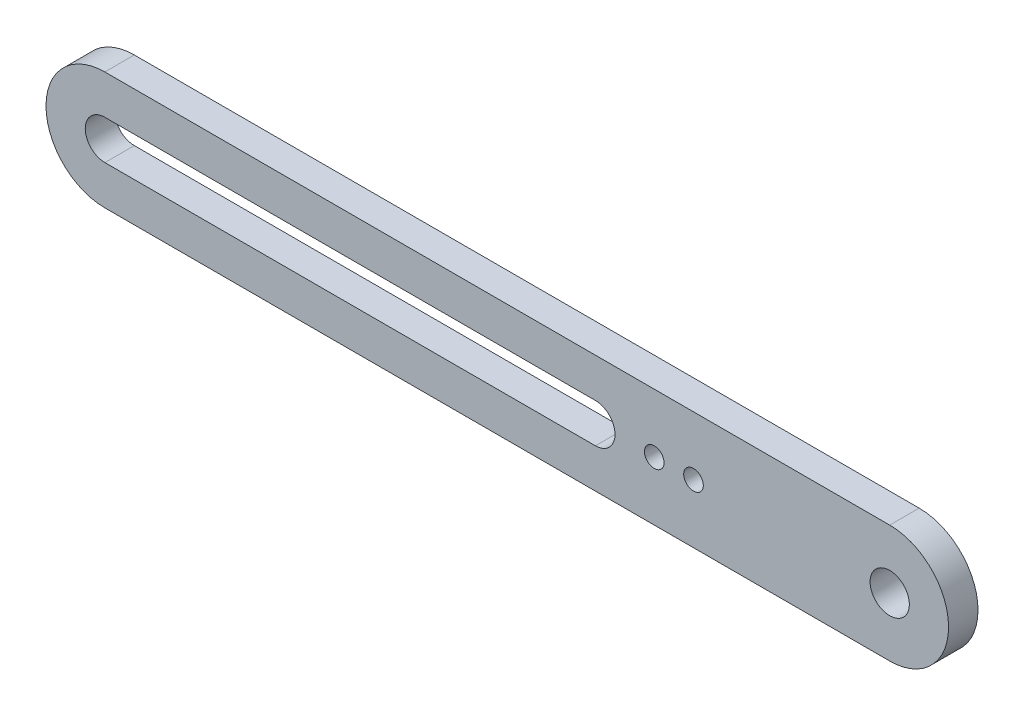
ISO-10303-21;
HEADER;
FILE_DESCRIPTION(('STEP AP214'),'2;1');
FILE_NAME('part.step','',(''),(''),'','','');
FILE_SCHEMA(('AUTOMOTIVE_DESIGN { 1 0 10303 214 1 1 1 1 }'));
ENDSEC;
DATA;
#1=APPLICATION_CONTEXT('core data for automotive mechanical design processes');
#2=APPLICATION_PROTOCOL_DEFINITION('international standard','automotive_design',2000,#1);
#3=PRODUCT_CONTEXT('',#1,'mechanical');
#4=PRODUCT('Part','Part','',(#3));
#5=PRODUCT_RELATED_PRODUCT_CATEGORY('part','',(#4));
#6=PRODUCT_DEFINITION_FORMATION('','',#4);
#7=PRODUCT_DEFINITION_CONTEXT('part definition',#1,'design');
#8=PRODUCT_DEFINITION('design','',#6,#7);
#9=PRODUCT_DEFINITION_SHAPE('','',#8);
#10=(LENGTH_UNIT() NAMED_UNIT(*) SI_UNIT(.MILLI.,.METRE.));
#11=(NAMED_UNIT(*) PLANE_ANGLE_UNIT() SI_UNIT($,.RADIAN.));
#12=(NAMED_UNIT(*) SI_UNIT($,.STERADIAN.) SOLID_ANGLE_UNIT());
#13=UNCERTAINTY_MEASURE_WITH_UNIT(LENGTH_MEASURE(1.E-05),#10,'distance_accuracy_value','');
#14=(GEOMETRIC_REPRESENTATION_CONTEXT(3) GLOBAL_UNCERTAINTY_ASSIGNED_CONTEXT((#13)) GLOBAL_UNIT_ASSIGNED_CONTEXT((#10,
#11,#12)) REPRESENTATION_CONTEXT('',''));
#15=CARTESIAN_POINT('',(0.,0.,0.));
#16=DIRECTION('',(0.,0.,1.));
#17=DIRECTION('',(1.,0.,0.));
#18=AXIS2_PLACEMENT_3D('',#15,#16,#17);
#19=CARTESIAN_POINT('',(0.,0.,0.));
#20=DIRECTION('',(0.,0.,1.));
#21=DIRECTION('',(1.,0.,0.));
#22=AXIS2_PLACEMENT_3D('',#19,#20,#21);
#23=PLANE('',#22);
#24=CARTESIAN_POINT('',(56.0000000000001,0.,0.));
#25=DIRECTION('',(0.,0.,-1.));
#26=DIRECTION('',(-1.,0.,0.));
#27=AXIS2_PLACEMENT_3D('',#24,#25,#26);
#28=CIRCLE('',#27,1.);
#29=CARTESIAN_POINT('',(55.0000000000001,0.,0.));
#30=VERTEX_POINT('',#29);
#31=EDGE_CURVE('E135',#30,#30,#28,.F.);
#32=ORIENTED_EDGE('',*,*,#31,.T.);
#33=EDGE_LOOP('',(#32));
#34=FACE_BOUND('',#33,.T.);
#35=CARTESIAN_POINT('',(60.0000000000001,0.,0.));
#36=DIRECTION('',(0.,0.,-1.));
#37=DIRECTION('',(-1.,0.,0.));
#38=AXIS2_PLACEMENT_3D('',#35,#36,#37);
#39=CIRCLE('',#38,1.);
#40=CARTESIAN_POINT('',(59.0000000000001,0.,0.));
#41=VERTEX_POINT('',#40);
#42=EDGE_CURVE('E20',#41,#41,#39,.F.);
#43=ORIENTED_EDGE('',*,*,#42,.T.);
#44=EDGE_LOOP('',(#43));
#45=FACE_BOUND('',#44,.T.);
#46=CARTESIAN_POINT('',(0.,0.,0.));
#47=DIRECTION('',(0.,0.,-1.));
#48=DIRECTION('',(-1.,0.,0.));
#49=AXIS2_PLACEMENT_3D('',#46,#47,#48);
#50=CIRCLE('',#49,2.);
#51=CARTESIAN_POINT('',(0.,2.,0.));
#52=VERTEX_POINT('',#51);
#53=CARTESIAN_POINT('',(0.,-2.,0.));
#54=VERTEX_POINT('',#53);
#55=EDGE_CURVE('E114',#52,#54,#50,.F.);
#56=ORIENTED_EDGE('',*,*,#55,.T.);
#57=DIRECTION('',(1.,0.,0.));
#58=VECTOR('',#57,1.);
#59=CARTESIAN_POINT('',(0.,-2.,0.));
#60=LINE('',#59,#58);
#61=CARTESIAN_POINT('',(50.,-2.,0.));
#62=VERTEX_POINT('',#61);
#63=EDGE_CURVE('E106',#62,#54,#60,.F.);
#64=ORIENTED_EDGE('',*,*,#63,.F.);
#65=CARTESIAN_POINT('',(50.,0.,0.));
#66=DIRECTION('',(0.,0.,-1.));
#67=DIRECTION('',(-1.,0.,0.));
#68=AXIS2_PLACEMENT_3D('',#65,#66,#67);
#69=CIRCLE('',#68,2.);
#70=CARTESIAN_POINT('',(50.,2.,0.));
#71=VERTEX_POINT('',#70);
#72=EDGE_CURVE('E138',#62,#71,#69,.F.);
#73=ORIENTED_EDGE('',*,*,#72,.T.);
#74=DIRECTION('',(1.,0.,0.));
#75=VECTOR('',#74,1.);
#76=CARTESIAN_POINT('',(0.,2.,0.));
#77=LINE('',#76,#75);
#78=EDGE_CURVE('E111',#52,#71,#77,.T.);
#79=ORIENTED_EDGE('',*,*,#78,.F.);
#80=EDGE_LOOP('',(#56,#64,#73,#79));
#81=FACE_BOUND('',#80,.T.);
#82=DIRECTION('',(1.,0.,0.));
#83=VECTOR('',#82,1.);
#84=CARTESIAN_POINT('',(0.,6.,0.));
#85=LINE('',#84,#83);
#86=CARTESIAN_POINT('',(0.,6.,0.));
#87=VERTEX_POINT('',#86);
#88=CARTESIAN_POINT('',(80.0000000000001,6.00000000000006,0.));
#89=VERTEX_POINT('',#88);
#90=EDGE_CURVE('E115',#87,#89,#85,.T.);
#91=ORIENTED_EDGE('',*,*,#90,.T.);
#92=CARTESIAN_POINT('',(80.0000000000001,0.,0.));
#93=DIRECTION('',(0.,0.,-1.));
#94=DIRECTION('',(-1.,0.,0.));
#95=AXIS2_PLACEMENT_3D('',#92,#93,#94);
#96=CIRCLE('',#95,6.00000000000006);
#97=CARTESIAN_POINT('',(80.0000000000001,-6.00000000000006,0.));
#98=VERTEX_POINT('',#97);
#99=EDGE_CURVE('E94',#98,#89,#96,.F.);
#100=ORIENTED_EDGE('',*,*,#99,.F.);
#101=DIRECTION('',(1.,0.,0.));
#102=VECTOR('',#101,1.);
#103=CARTESIAN_POINT('',(0.,-6.00000000000006,0.));
#104=LINE('',#103,#102);
#105=CARTESIAN_POINT('',(0.,-6.00000000000006,0.));
#106=VERTEX_POINT('',#105);
#107=EDGE_CURVE('E92',#98,#106,#104,.F.);
#108=ORIENTED_EDGE('',*,*,#107,.T.);
#109=CARTESIAN_POINT('',(0.,0.,0.));
#110=DIRECTION('',(0.,0.,-1.));
#111=DIRECTION('',(-1.,0.,0.));
#112=AXIS2_PLACEMENT_3D('',#109,#110,#111);
#113=CIRCLE('',#112,6.00000000000003);
#114=EDGE_CURVE('E80',#87,#106,#113,.F.);
#115=ORIENTED_EDGE('',*,*,#114,.F.);
#116=EDGE_LOOP('',(#91,#100,#108,#115));
#117=FACE_BOUND('',#116,.T.);
#118=CARTESIAN_POINT('',(80.0000000000001,0.,0.));
#119=DIRECTION('',(0.,0.,-1.));
#120=DIRECTION('',(-1.,0.,0.));
#121=AXIS2_PLACEMENT_3D('',#118,#119,#120);
#122=CIRCLE('',#121,2.);
#123=CARTESIAN_POINT('',(78.0000000000001,0.,0.));
#124=VERTEX_POINT('',#123);
#125=EDGE_CURVE('E110',#124,#124,#122,.F.);
#126=ORIENTED_EDGE('',*,*,#125,.T.);
#127=EDGE_LOOP('',(#126));
#128=FACE_BOUND('',#127,.T.);
#129=ADVANCED_FACE('F17',(#34,#45,#81,#117,#128),#23,.F.);
#130=CARTESIAN_POINT('',(60.0000000000001,0.,3.));
#131=DIRECTION('',(0.,0.,-1.));
#132=DIRECTION('',(-1.,0.,0.));
#133=AXIS2_PLACEMENT_3D('',#130,#131,#132);
#134=CYLINDRICAL_SURFACE('',#133,1.);
#135=CARTESIAN_POINT('',(60.0000000000001,0.,3.));
#136=DIRECTION('',(0.,0.,-1.));
#137=DIRECTION('',(-1.,0.,0.));
#138=AXIS2_PLACEMENT_3D('',#135,#136,#137);
#139=CIRCLE('',#138,1.);
#140=CARTESIAN_POINT('',(59.0000000000001,0.,3.));
#141=VERTEX_POINT('',#140);
#142=EDGE_CURVE('E132',#141,#141,#139,.T.);
#143=ORIENTED_EDGE('',*,*,#142,.F.);
#144=EDGE_LOOP('',(#143));
#145=FACE_BOUND('',#144,.T.);
#146=ORIENTED_EDGE('',*,*,#42,.F.);
#147=EDGE_LOOP('',(#146));
#148=FACE_BOUND('',#147,.T.);
#149=ADVANCED_FACE('F203',(#145,#148),#134,.F.);
#150=CARTESIAN_POINT('',(0.,0.,3.));
#151=DIRECTION('',(0.,0.,-1.));
#152=DIRECTION('',(-1.,0.,0.));
#153=AXIS2_PLACEMENT_3D('',#150,#151,#152);
#154=CYLINDRICAL_SURFACE('',#153,6.00000000000003);
#155=ORIENTED_EDGE('',*,*,#114,.T.);
#156=DIRECTION('',(0.,0.,1.));
#157=VECTOR('',#156,1.);
#158=CARTESIAN_POINT('',(0.,-6.00000000000006,3.));
#159=LINE('',#158,#157);
#160=CARTESIAN_POINT('',(0.,-6.00000000000006,3.));
#161=VERTEX_POINT('',#160);
#162=EDGE_CURVE('E84',#106,#161,#159,.T.);
#163=ORIENTED_EDGE('',*,*,#162,.T.);
#164=CARTESIAN_POINT('',(0.,0.,3.));
#165=DIRECTION('',(0.,0.,-1.));
#166=DIRECTION('',(-1.,0.,0.));
#167=AXIS2_PLACEMENT_3D('',#164,#165,#166);
#168=CIRCLE('',#167,6.00000000000003);
#169=CARTESIAN_POINT('',(0.,6.00000000000003,3.));
#170=VERTEX_POINT('',#169);
#171=EDGE_CURVE('E130',#170,#161,#168,.F.);
#172=ORIENTED_EDGE('',*,*,#171,.F.);
#173=DIRECTION('',(0.,0.,1.));
#174=VECTOR('',#173,1.);
#175=CARTESIAN_POINT('',(0.,6.,3.));
#176=LINE('',#175,#174);
#177=EDGE_CURVE('E87',#170,#87,#176,.F.);
#178=ORIENTED_EDGE('',*,*,#177,.T.);
#179=EDGE_LOOP('',(#155,#163,#172,#178));
#180=FACE_BOUND('',#179,.T.);
#181=ADVANCED_FACE('F82',(#180),#154,.T.);
#182=CARTESIAN_POINT('',(0.,-6.00000000000006,3.));
#183=DIRECTION('',(0.,1.,0.));
#184=DIRECTION('',(0.,0.,1.));
#185=AXIS2_PLACEMENT_3D('',#182,#183,#184);
#186=PLANE('',#185);
#187=DIRECTION('',(0.,0.,-1.));
#188=VECTOR('',#187,1.);
#189=CARTESIAN_POINT('',(80.0000000000001,-6.00000000000006,3.));
#190=LINE('',#189,#188);
#191=CARTESIAN_POINT('',(80.0000000000001,-6.00000000000006,3.));
#192=VERTEX_POINT('',#191);
#193=EDGE_CURVE('E104',#192,#98,#190,.T.);
#194=ORIENTED_EDGE('',*,*,#193,.F.);
#195=DIRECTION('',(1.,0.,0.));
#196=VECTOR('',#195,1.);
#197=CARTESIAN_POINT('',(0.,-6.00000000000006,3.));
#198=LINE('',#197,#196);
#199=EDGE_CURVE('E100',#161,#192,#198,.T.);
#200=ORIENTED_EDGE('',*,*,#199,.F.);
#201=ORIENTED_EDGE('',*,*,#162,.F.);
#202=ORIENTED_EDGE('',*,*,#107,.F.);
#203=EDGE_LOOP('',(#194,#200,#201,#202));
#204=FACE_BOUND('',#203,.T.);
#205=ADVANCED_FACE('F98',(#204),#186,.F.);
#206=CARTESIAN_POINT('',(80.0000000000001,0.,3.));
#207=DIRECTION('',(0.,0.,-1.));
#208=DIRECTION('',(-1.,0.,0.));
#209=AXIS2_PLACEMENT_3D('',#206,#207,#208);
#210=CYLINDRICAL_SURFACE('',#209,6.00000000000006);
#211=CARTESIAN_POINT('',(80.0000000000001,0.,3.));
#212=DIRECTION('',(0.,0.,-1.));
#213=DIRECTION('',(-1.,0.,0.));
#214=AXIS2_PLACEMENT_3D('',#211,#212,#213);
#215=CIRCLE('',#214,6.00000000000006);
#216=CARTESIAN_POINT('',(80.0000000000001,6.00000000000006,3.));
#217=VERTEX_POINT('',#216);
#218=EDGE_CURVE('E127',#192,#217,#215,.F.);
#219=ORIENTED_EDGE('',*,*,#218,.F.);
#220=ORIENTED_EDGE('',*,*,#193,.T.);
#221=ORIENTED_EDGE('',*,*,#99,.T.);
#222=DIRECTION('',(0.,0.,1.));
#223=VECTOR('',#222,1.);
#224=CARTESIAN_POINT('',(80.0000000000001,6.00000000000006,3.));
#225=LINE('',#224,#223);
#226=EDGE_CURVE('E146',#89,#217,#225,.T.);
#227=ORIENTED_EDGE('',*,*,#226,.T.);
#228=EDGE_LOOP('',(#219,#220,#221,#227));
#229=FACE_BOUND('',#228,.T.);
#230=ADVANCED_FACE('F217',(#229),#210,.T.);
#231=CARTESIAN_POINT('',(0.,6.,3.));
#232=DIRECTION('',(0.,-1.,0.));
#233=DIRECTION('',(1.,0.,0.));
#234=AXIS2_PLACEMENT_3D('',#231,#232,#233);
#235=PLANE('',#234);
#236=ORIENTED_EDGE('',*,*,#177,.F.);
#237=DIRECTION('',(1.,0.,0.));
#238=VECTOR('',#237,1.);
#239=CARTESIAN_POINT('',(0.,6.00000000000006,3.));
#240=LINE('',#239,#238);
#241=EDGE_CURVE('E126',#217,#170,#240,.F.);
#242=ORIENTED_EDGE('',*,*,#241,.F.);
#243=ORIENTED_EDGE('',*,*,#226,.F.);
#244=ORIENTED_EDGE('',*,*,#90,.F.);
#245=EDGE_LOOP('',(#236,#242,#243,#244));
#246=FACE_BOUND('',#245,.T.);
#247=ADVANCED_FACE('F220',(#246),#235,.F.);
#248=CARTESIAN_POINT('',(80.0000000000001,0.,3.));
#249=DIRECTION('',(0.,0.,-1.));
#250=DIRECTION('',(-1.,0.,0.));
#251=AXIS2_PLACEMENT_3D('',#248,#249,#250);
#252=CYLINDRICAL_SURFACE('',#251,2.);
#253=CARTESIAN_POINT('',(80.0000000000001,0.,3.));
#254=DIRECTION('',(0.,0.,-1.));
#255=DIRECTION('',(-1.,0.,0.));
#256=AXIS2_PLACEMENT_3D('',#253,#254,#255);
#257=CIRCLE('',#256,2.);
#258=CARTESIAN_POINT('',(78.0000000000001,0.,3.));
#259=VERTEX_POINT('',#258);
#260=EDGE_CURVE('E123',#259,#259,#257,.T.);
#261=ORIENTED_EDGE('',*,*,#260,.F.);
#262=EDGE_LOOP('',(#261));
#263=FACE_BOUND('',#262,.T.);
#264=ORIENTED_EDGE('',*,*,#125,.F.);
#265=EDGE_LOOP('',(#264));
#266=FACE_BOUND('',#265,.T.);
#267=ADVANCED_FACE('F223',(#263,#266),#252,.F.);
#268=CARTESIAN_POINT('',(0.,-2.,3.));
#269=DIRECTION('',(0.,1.,0.));
#270=DIRECTION('',(0.,0.,1.));
#271=AXIS2_PLACEMENT_3D('',#268,#269,#270);
#272=PLANE('',#271);
#273=DIRECTION('',(1.,0.,0.));
#274=VECTOR('',#273,1.);
#275=CARTESIAN_POINT('',(0.,-2.,3.));
#276=LINE('',#275,#274);
#277=CARTESIAN_POINT('',(50.,-2.,3.));
#278=VERTEX_POINT('',#277);
#279=CARTESIAN_POINT('',(0.,-2.,3.));
#280=VERTEX_POINT('',#279);
#281=EDGE_CURVE('E122',#278,#280,#276,.F.);
#282=ORIENTED_EDGE('',*,*,#281,.F.);
#283=DIRECTION('',(0.,0.,-1.));
#284=VECTOR('',#283,1.);
#285=CARTESIAN_POINT('',(50.,-2.,3.));
#286=LINE('',#285,#284);
#287=EDGE_CURVE('E141',#278,#62,#286,.T.);
#288=ORIENTED_EDGE('',*,*,#287,.T.);
#289=ORIENTED_EDGE('',*,*,#63,.T.);
#290=DIRECTION('',(0.,0.,-1.));
#291=VECTOR('',#290,1.);
#292=CARTESIAN_POINT('',(0.,-2.,3.));
#293=LINE('',#292,#291);
#294=EDGE_CURVE('E109',#54,#280,#293,.F.);
#295=ORIENTED_EDGE('',*,*,#294,.T.);
#296=EDGE_LOOP('',(#282,#288,#289,#295));
#297=FACE_BOUND('',#296,.T.);
#298=ADVANCED_FACE('F176',(#297),#272,.T.);
#299=CARTESIAN_POINT('',(0.,0.,3.));
#300=DIRECTION('',(0.,0.,-1.));
#301=DIRECTION('',(-1.,0.,0.));
#302=AXIS2_PLACEMENT_3D('',#299,#300,#301);
#303=CYLINDRICAL_SURFACE('',#302,2.);
#304=DIRECTION('',(0.,0.,-1.));
#305=VECTOR('',#304,1.);
#306=CARTESIAN_POINT('',(0.,2.,3.));
#307=LINE('',#306,#305);
#308=CARTESIAN_POINT('',(0.,2.,3.));
#309=VERTEX_POINT('',#308);
#310=EDGE_CURVE('E113',#309,#52,#307,.T.);
#311=ORIENTED_EDGE('',*,*,#310,.F.);
#312=CARTESIAN_POINT('',(0.,0.,3.));
#313=DIRECTION('',(0.,0.,-1.));
#314=DIRECTION('',(-1.,0.,0.));
#315=AXIS2_PLACEMENT_3D('',#312,#313,#314);
#316=CIRCLE('',#315,2.);
#317=EDGE_CURVE('E120',#280,#309,#316,.T.);
#318=ORIENTED_EDGE('',*,*,#317,.F.);
#319=ORIENTED_EDGE('',*,*,#294,.F.);
#320=ORIENTED_EDGE('',*,*,#55,.F.);
#321=EDGE_LOOP('',(#311,#318,#319,#320));
#322=FACE_BOUND('',#321,.T.);
#323=ADVANCED_FACE('F172',(#322),#303,.F.);
#324=CARTESIAN_POINT('',(0.,2.,3.));
#325=DIRECTION('',(0.,-1.,0.));
#326=DIRECTION('',(0.,0.,-1.));
#327=AXIS2_PLACEMENT_3D('',#324,#325,#326);
#328=PLANE('',#327);
#329=DIRECTION('',(1.,0.,0.));
#330=VECTOR('',#329,1.);
#331=CARTESIAN_POINT('',(0.,2.,3.));
#332=LINE('',#331,#330);
#333=CARTESIAN_POINT('',(50.,2.,3.));
#334=VERTEX_POINT('',#333);
#335=EDGE_CURVE('E119',#309,#334,#332,.T.);
#336=ORIENTED_EDGE('',*,*,#335,.F.);
#337=ORIENTED_EDGE('',*,*,#310,.T.);
#338=ORIENTED_EDGE('',*,*,#78,.T.);
#339=DIRECTION('',(0.,0.,-1.));
#340=VECTOR('',#339,1.);
#341=CARTESIAN_POINT('',(50.,2.,3.));
#342=LINE('',#341,#340);
#343=EDGE_CURVE('E35',#71,#334,#342,.F.);
#344=ORIENTED_EDGE('',*,*,#343,.T.);
#345=EDGE_LOOP('',(#336,#337,#338,#344));
#346=FACE_BOUND('',#345,.T.);
#347=ADVANCED_FACE('F169',(#346),#328,.T.);
#348=CARTESIAN_POINT('',(50.,0.,3.));
#349=DIRECTION('',(0.,0.,-1.));
#350=DIRECTION('',(-1.,0.,0.));
#351=AXIS2_PLACEMENT_3D('',#348,#349,#350);
#352=CYLINDRICAL_SURFACE('',#351,2.);
#353=ORIENTED_EDGE('',*,*,#287,.F.);
#354=CARTESIAN_POINT('',(50.,0.,3.));
#355=DIRECTION('',(0.,0.,-1.));
#356=DIRECTION('',(-1.,0.,0.));
#357=AXIS2_PLACEMENT_3D('',#354,#355,#356);
#358=CIRCLE('',#357,2.);
#359=EDGE_CURVE('E26',#334,#278,#358,.T.);
#360=ORIENTED_EDGE('',*,*,#359,.F.);
#361=ORIENTED_EDGE('',*,*,#343,.F.);
#362=ORIENTED_EDGE('',*,*,#72,.F.);
#363=EDGE_LOOP('',(#353,#360,#361,#362));
#364=FACE_BOUND('',#363,.T.);
#365=ADVANCED_FACE('F180',(#364),#352,.F.);
#366=CARTESIAN_POINT('',(56.0000000000001,0.,3.));
#367=DIRECTION('',(0.,0.,-1.));
#368=DIRECTION('',(-1.,0.,0.));
#369=AXIS2_PLACEMENT_3D('',#366,#367,#368);
#370=CYLINDRICAL_SURFACE('',#369,1.);
#371=CARTESIAN_POINT('',(56.0000000000001,0.,3.));
#372=DIRECTION('',(0.,0.,-1.));
#373=DIRECTION('',(-1.,0.,0.));
#374=AXIS2_PLACEMENT_3D('',#371,#372,#373);
#375=CIRCLE('',#374,1.);
#376=CARTESIAN_POINT('',(55.0000000000001,0.,3.));
#377=VERTEX_POINT('',#376);
#378=EDGE_CURVE('E11',#377,#377,#375,.T.);
#379=ORIENTED_EDGE('',*,*,#378,.F.);
#380=EDGE_LOOP('',(#379));
#381=FACE_BOUND('',#380,.T.);
#382=ORIENTED_EDGE('',*,*,#31,.F.);
#383=EDGE_LOOP('',(#382));
#384=FACE_BOUND('',#383,.T.);
#385=ADVANCED_FACE('F182',(#381,#384),#370,.F.);
#386=CARTESIAN_POINT('',(0.,0.,3.));
#387=DIRECTION('',(0.,0.,1.));
#388=DIRECTION('',(1.,0.,0.));
#389=AXIS2_PLACEMENT_3D('',#386,#387,#388);
#390=PLANE('',#389);
#391=ORIENTED_EDGE('',*,*,#378,.T.);
#392=EDGE_LOOP('',(#391));
#393=FACE_BOUND('',#392,.T.);
#394=ORIENTED_EDGE('',*,*,#335,.T.);
#395=ORIENTED_EDGE('',*,*,#359,.T.);
#396=ORIENTED_EDGE('',*,*,#281,.T.);
#397=ORIENTED_EDGE('',*,*,#317,.T.);
#398=EDGE_LOOP('',(#394,#395,#396,#397));
#399=FACE_BOUND('',#398,.T.);
#400=ORIENTED_EDGE('',*,*,#260,.T.);
#401=EDGE_LOOP('',(#400));
#402=FACE_BOUND('',#401,.T.);
#403=ORIENTED_EDGE('',*,*,#218,.T.);
#404=ORIENTED_EDGE('',*,*,#241,.T.);
#405=ORIENTED_EDGE('',*,*,#171,.T.);
#406=ORIENTED_EDGE('',*,*,#199,.T.);
#407=EDGE_LOOP('',(#403,#404,#405,#406));
#408=FACE_BOUND('',#407,.T.);
#409=ORIENTED_EDGE('',*,*,#142,.T.);
#410=EDGE_LOOP('',(#409));
#411=FACE_BOUND('',#410,.T.);
#412=ADVANCED_FACE('F165',(#393,#399,#402,#408,#411),#390,.T.);
#413=CLOSED_SHELL('',(#129,#149,#181,#205,#230,#247,#267,#298,#323,#347,#365,#385,#412));
#414=MANIFOLD_SOLID_BREP('B1',#413);
#415=ADVANCED_BREP_SHAPE_REPRESENTATION('',(#18,#414),#14);
#416=SHAPE_DEFINITION_REPRESENTATION(#9,#415);
ENDSEC;
END-ISO-10303-21;
